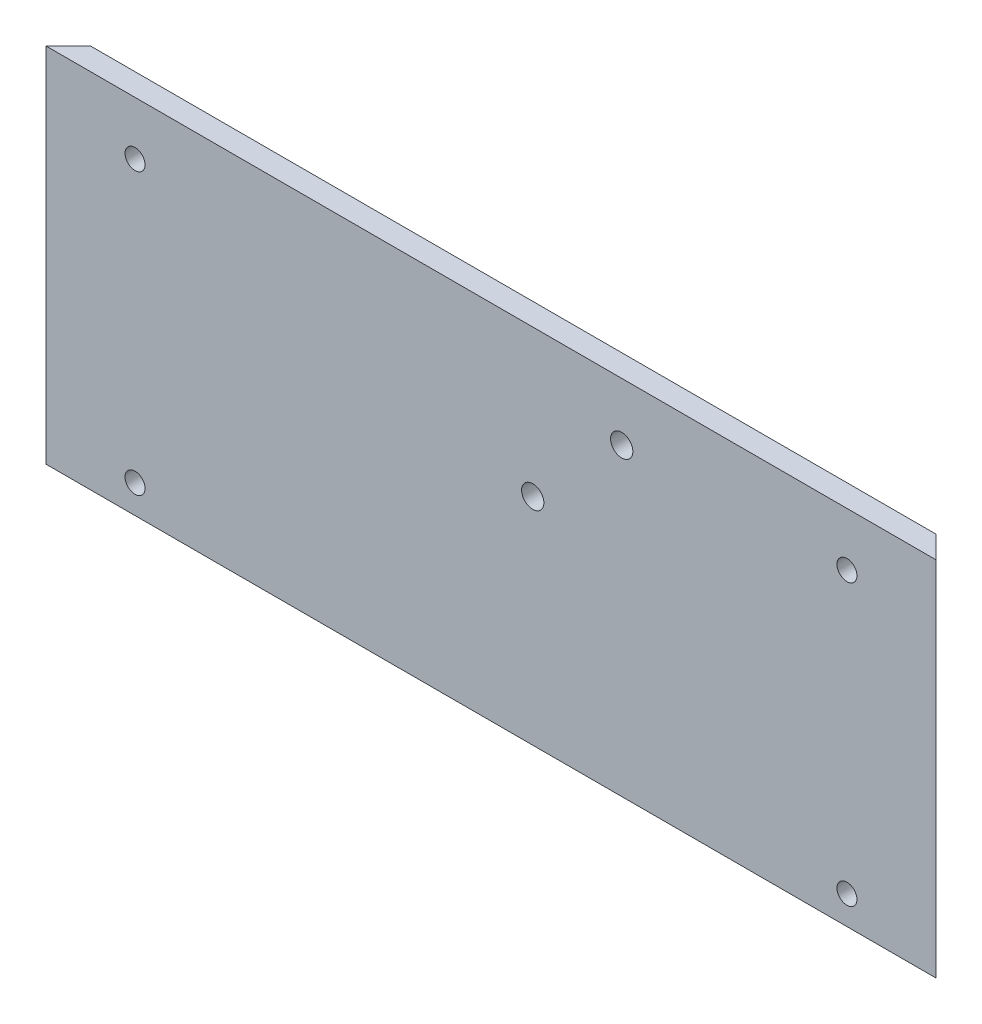
ISO-10303-21;
HEADER;
FILE_DESCRIPTION(('STEP AP214'),'2;1');
FILE_NAME('part.step','',(''),(''),'','','');
FILE_SCHEMA(('AUTOMOTIVE_DESIGN { 1 0 10303 214 1 1 1 1 }'));
ENDSEC;
DATA;
#1=APPLICATION_CONTEXT('core data for automotive mechanical design processes');
#2=APPLICATION_PROTOCOL_DEFINITION('international standard','automotive_design',2000,#1);
#3=PRODUCT_CONTEXT('',#1,'mechanical');
#4=PRODUCT('Part','Part','',(#3));
#5=PRODUCT_RELATED_PRODUCT_CATEGORY('part','',(#4));
#6=PRODUCT_DEFINITION_FORMATION('','',#4);
#7=PRODUCT_DEFINITION_CONTEXT('part definition',#1,'design');
#8=PRODUCT_DEFINITION('design','',#6,#7);
#9=PRODUCT_DEFINITION_SHAPE('','',#8);
#10=(LENGTH_UNIT() NAMED_UNIT(*) SI_UNIT(.MILLI.,.METRE.));
#11=(NAMED_UNIT(*) PLANE_ANGLE_UNIT() SI_UNIT($,.RADIAN.));
#12=(NAMED_UNIT(*) SI_UNIT($,.STERADIAN.) SOLID_ANGLE_UNIT());
#13=UNCERTAINTY_MEASURE_WITH_UNIT(LENGTH_MEASURE(1.E-05),#10,'distance_accuracy_value','');
#14=(GEOMETRIC_REPRESENTATION_CONTEXT(3) GLOBAL_UNCERTAINTY_ASSIGNED_CONTEXT((#13)) GLOBAL_UNIT_ASSIGNED_CONTEXT((#10,
#11,#12)) REPRESENTATION_CONTEXT('',''));
#15=CARTESIAN_POINT('',(0.,0.,0.));
#16=DIRECTION('',(0.,0.,1.));
#17=DIRECTION('',(1.,0.,0.));
#18=AXIS2_PLACEMENT_3D('',#15,#16,#17);
#19=CARTESIAN_POINT('',(0.,84.,-5.));
#20=DIRECTION('',(0.,1.,0.));
#21=DIRECTION('',(0.,0.,1.));
#22=AXIS2_PLACEMENT_3D('',#19,#20,#21);
#23=PLANE('',#22);
#24=DIRECTION('',(-0.707106781186546,0.,-0.707106781186549));
#25=VECTOR('',#24,1.);
#26=CARTESIAN_POINT('',(97.5000000000003,84.,-102.5));
#27=LINE('',#26,#25);
#28=CARTESIAN_POINT('',(200.,84.,0.));
#29=VERTEX_POINT('',#28);
#30=CARTESIAN_POINT('',(195.,84.,-4.99999999999998));
#31=VERTEX_POINT('',#30);
#32=EDGE_CURVE('E130',#29,#31,#27,.T.);
#33=ORIENTED_EDGE('',*,*,#32,.T.);
#34=DIRECTION('',(-1.,0.,0.));
#35=VECTOR('',#34,1.);
#36=CARTESIAN_POINT('',(8.00000000000001,84.,-5.));
#37=LINE('',#36,#35);
#38=CARTESIAN_POINT('',(5.00000000000002,84.,-5.));
#39=VERTEX_POINT('',#38);
#40=EDGE_CURVE('E65',#31,#39,#37,.T.);
#41=ORIENTED_EDGE('',*,*,#40,.T.);
#42=DIRECTION('',(-0.707106781186546,0.,0.707106781186549));
#43=VECTOR('',#42,1.);
#44=CARTESIAN_POINT('',(2.50000000000002,84.,-2.49999999999999));
#45=LINE('',#44,#43);
#46=CARTESIAN_POINT('',(0.,84.,0.));
#47=VERTEX_POINT('',#46);
#48=EDGE_CURVE('E125',#39,#47,#45,.T.);
#49=ORIENTED_EDGE('',*,*,#48,.T.);
#50=DIRECTION('',(-1.,0.,0.));
#51=VECTOR('',#50,1.);
#52=CARTESIAN_POINT('',(0.,84.,0.));
#53=LINE('',#52,#51);
#54=EDGE_CURVE('E166',#29,#47,#53,.T.);
#55=ORIENTED_EDGE('',*,*,#54,.F.);
#56=EDGE_LOOP('',(#33,#41,#49,#55));
#57=FACE_BOUND('',#56,.T.);
#58=ADVANCED_FACE('F41',(#57),#23,.T.);
#59=CARTESIAN_POINT('',(0.,0.,-5.));
#60=DIRECTION('',(0.,0.,-1.));
#61=DIRECTION('',(-1.,0.,0.));
#62=AXIS2_PLACEMENT_3D('',#59,#60,#61);
#63=PLANE('',#62);
#64=DIRECTION('',(1.,0.,0.));
#65=VECTOR('',#64,1.);
#66=CARTESIAN_POINT('',(-5.,2.59999999999993,-4.99999999999971));
#67=LINE('',#66,#65);
#68=CARTESIAN_POINT('',(4.99999999999973,2.59999999999993,-4.99999999999971));
#69=VERTEX_POINT('',#68);
#70=CARTESIAN_POINT('',(195.,2.59999999999993,-4.99999999999971));
#71=VERTEX_POINT('',#70);
#72=EDGE_CURVE('E100',#69,#71,#67,.T.);
#73=ORIENTED_EDGE('',*,*,#72,.F.);
#74=DIRECTION('',(0.,1.,0.));
#75=VECTOR('',#74,1.);
#76=CARTESIAN_POINT('',(5.00000000000002,0.,-5.));
#77=LINE('',#76,#75);
#78=CARTESIAN_POINT('',(5.00000000000002,5.,-5.));
#79=VERTEX_POINT('',#78);
#80=EDGE_CURVE('E126',#69,#79,#77,.T.);
#81=ORIENTED_EDGE('',*,*,#80,.T.);
#82=DIRECTION('',(-1.,0.,0.));
#83=VECTOR('',#82,1.);
#84=CARTESIAN_POINT('',(0.,5.,-5.));
#85=LINE('',#84,#83);
#86=CARTESIAN_POINT('',(195.,4.99999999999996,-5.));
#87=VERTEX_POINT('',#86);
#88=EDGE_CURVE('E123',#87,#79,#85,.T.);
#89=ORIENTED_EDGE('',*,*,#88,.F.);
#90=DIRECTION('',(0.,-1.,0.));
#91=VECTOR('',#90,1.);
#92=CARTESIAN_POINT('',(195.,0.,-5.));
#93=LINE('',#92,#91);
#94=EDGE_CURVE('E114',#87,#71,#93,.T.);
#95=ORIENTED_EDGE('',*,*,#94,.T.);
#96=EDGE_LOOP('',(#73,#81,#89,#95));
#97=FACE_BOUND('',#96,.T.);
#98=ADVANCED_FACE('F121',(#97),#63,.T.);
#99=CARTESIAN_POINT('',(0.,0.,0.));
#100=DIRECTION('',(0.,0.,-1.));
#101=DIRECTION('',(-1.,0.,0.));
#102=AXIS2_PLACEMENT_3D('',#99,#100,#101);
#103=PLANE('',#102);
#104=CARTESIAN_POINT('',(129.377508283547,71.,0.));
#105=DIRECTION('',(0.,0.,1.));
#106=DIRECTION('',(1.,0.,0.));
#107=AXIS2_PLACEMENT_3D('',#104,#105,#106);
#108=CIRCLE('',#107,2.5);
#109=CARTESIAN_POINT('',(131.877508283547,71.,0.));
#110=VERTEX_POINT('',#109);
#111=EDGE_CURVE('E187',#110,#110,#108,.T.);
#112=ORIENTED_EDGE('',*,*,#111,.F.);
#113=EDGE_LOOP('',(#112));
#114=FACE_BOUND('',#113,.T.);
#115=CARTESIAN_POINT('',(109.377508283547,51.,0.));
#116=DIRECTION('',(0.,0.,1.));
#117=DIRECTION('',(1.,0.,0.));
#118=AXIS2_PLACEMENT_3D('',#115,#116,#117);
#119=CIRCLE('',#118,2.5);
#120=CARTESIAN_POINT('',(111.877508283547,51.,0.));
#121=VERTEX_POINT('',#120);
#122=EDGE_CURVE('E192',#121,#121,#119,.T.);
#123=ORIENTED_EDGE('',*,*,#122,.F.);
#124=EDGE_LOOP('',(#123));
#125=FACE_BOUND('',#124,.T.);
#126=CARTESIAN_POINT('',(180.,72.,0.));
#127=DIRECTION('',(0.,0.,1.));
#128=DIRECTION('',(-1.,0.,0.));
#129=AXIS2_PLACEMENT_3D('',#126,#127,#128);
#130=CIRCLE('',#129,2.25000000000001);
#131=CARTESIAN_POINT('',(177.75,72.,0.));
#132=VERTEX_POINT('',#131);
#133=EDGE_CURVE('E202',#132,#132,#130,.T.);
#134=ORIENTED_EDGE('',*,*,#133,.F.);
#135=EDGE_LOOP('',(#134));
#136=FACE_BOUND('',#135,.T.);
#137=CARTESIAN_POINT('',(20.,72.,0.));
#138=DIRECTION('',(0.,0.,1.));
#139=DIRECTION('',(1.,0.,0.));
#140=AXIS2_PLACEMENT_3D('',#137,#138,#139);
#141=CIRCLE('',#140,2.25);
#142=CARTESIAN_POINT('',(22.25,72.,0.));
#143=VERTEX_POINT('',#142);
#144=EDGE_CURVE('E206',#143,#143,#141,.T.);
#145=ORIENTED_EDGE('',*,*,#144,.F.);
#146=EDGE_LOOP('',(#145));
#147=FACE_BOUND('',#146,.T.);
#148=CARTESIAN_POINT('',(180.,9.,0.));
#149=DIRECTION('',(0.,0.,1.));
#150=DIRECTION('',(-1.,0.,0.));
#151=AXIS2_PLACEMENT_3D('',#148,#149,#150);
#152=CIRCLE('',#151,2.25000000000001);
#153=CARTESIAN_POINT('',(177.75,9.,0.));
#154=VERTEX_POINT('',#153);
#155=EDGE_CURVE('E210',#154,#154,#152,.T.);
#156=ORIENTED_EDGE('',*,*,#155,.F.);
#157=EDGE_LOOP('',(#156));
#158=FACE_BOUND('',#157,.T.);
#159=CARTESIAN_POINT('',(20.,9.,0.));
#160=DIRECTION('',(0.,0.,1.));
#161=DIRECTION('',(1.,0.,0.));
#162=AXIS2_PLACEMENT_3D('',#159,#160,#161);
#163=CIRCLE('',#162,2.25);
#164=CARTESIAN_POINT('',(22.25,9.,0.));
#165=VERTEX_POINT('',#164);
#166=EDGE_CURVE('E214',#165,#165,#163,.T.);
#167=ORIENTED_EDGE('',*,*,#166,.F.);
#168=EDGE_LOOP('',(#167));
#169=FACE_BOUND('',#168,.T.);
#170=DIRECTION('',(0.,-1.,0.));
#171=VECTOR('',#170,1.);
#172=CARTESIAN_POINT('',(0.,0.,0.));
#173=LINE('',#172,#171);
#174=CARTESIAN_POINT('',(0.,2.59999999999993,0.));
#175=VERTEX_POINT('',#174);
#176=EDGE_CURVE('E175',#47,#175,#173,.T.);
#177=ORIENTED_EDGE('',*,*,#176,.T.);
#178=DIRECTION('',(1.,0.,0.));
#179=VECTOR('',#178,1.);
#180=CARTESIAN_POINT('',(0.,2.59999999999993,3.33066907387547E-13));
#181=LINE('',#180,#179);
#182=CARTESIAN_POINT('',(200.,2.59999999999993,3.33066907387547E-13));
#183=VERTEX_POINT('',#182);
#184=EDGE_CURVE('E57',#175,#183,#181,.T.);
#185=ORIENTED_EDGE('',*,*,#184,.T.);
#186=DIRECTION('',(0.,1.,0.));
#187=VECTOR('',#186,1.);
#188=CARTESIAN_POINT('',(200.,0.,0.));
#189=LINE('',#188,#187);
#190=EDGE_CURVE('E116',#183,#29,#189,.T.);
#191=ORIENTED_EDGE('',*,*,#190,.T.);
#192=ORIENTED_EDGE('',*,*,#54,.T.);
#193=EDGE_LOOP('',(#177,#185,#191,#192));
#194=FACE_BOUND('',#193,.T.);
#195=ADVANCED_FACE('F218',(#114,#125,#136,#147,#158,#169,#194),#103,.F.);
#196=CARTESIAN_POINT('',(20.,9.,-5.));
#197=DIRECTION('',(0.,0.,1.));
#198=DIRECTION('',(1.,0.,0.));
#199=AXIS2_PLACEMENT_3D('',#196,#197,#198);
#200=CYLINDRICAL_SURFACE('',#199,2.25);
#201=ORIENTED_EDGE('',*,*,#166,.T.);
#202=EDGE_LOOP('',(#201));
#203=FACE_BOUND('',#202,.T.);
#204=CARTESIAN_POINT('',(20.,9.,-8.));
#205=DIRECTION('',(0.,0.,-1.));
#206=DIRECTION('',(-1.,0.,0.));
#207=AXIS2_PLACEMENT_3D('',#204,#205,#206);
#208=CIRCLE('',#207,2.25);
#209=CARTESIAN_POINT('',(17.75,9.,-8.));
#210=VERTEX_POINT('',#209);
#211=EDGE_CURVE('E230',#210,#210,#208,.T.);
#212=ORIENTED_EDGE('',*,*,#211,.T.);
#213=EDGE_LOOP('',(#212));
#214=FACE_BOUND('',#213,.T.);
#215=ADVANCED_FACE('F311',(#203,#214),#200,.F.);
#216=CARTESIAN_POINT('',(180.,9.,-5.));
#217=DIRECTION('',(0.,0.,1.));
#218=DIRECTION('',(1.,0.,0.));
#219=AXIS2_PLACEMENT_3D('',#216,#217,#218);
#220=CYLINDRICAL_SURFACE('',#219,2.25000000000001);
#221=ORIENTED_EDGE('',*,*,#155,.T.);
#222=EDGE_LOOP('',(#221));
#223=FACE_BOUND('',#222,.T.);
#224=CARTESIAN_POINT('',(180.,9.,-8.));
#225=DIRECTION('',(0.,0.,-1.));
#226=DIRECTION('',(-1.,0.,0.));
#227=AXIS2_PLACEMENT_3D('',#224,#225,#226);
#228=CIRCLE('',#227,2.25000000000001);
#229=CARTESIAN_POINT('',(177.75,9.,-8.));
#230=VERTEX_POINT('',#229);
#231=EDGE_CURVE('E224',#230,#230,#228,.T.);
#232=ORIENTED_EDGE('',*,*,#231,.T.);
#233=EDGE_LOOP('',(#232));
#234=FACE_BOUND('',#233,.T.);
#235=ADVANCED_FACE('F261',(#223,#234),#220,.F.);
#236=CARTESIAN_POINT('',(20.,72.,-5.));
#237=DIRECTION('',(0.,0.,1.));
#238=DIRECTION('',(1.,0.,0.));
#239=AXIS2_PLACEMENT_3D('',#236,#237,#238);
#240=CYLINDRICAL_SURFACE('',#239,2.25);
#241=ORIENTED_EDGE('',*,*,#144,.T.);
#242=EDGE_LOOP('',(#241));
#243=FACE_BOUND('',#242,.T.);
#244=CARTESIAN_POINT('',(20.,72.,-8.));
#245=DIRECTION('',(0.,0.,-1.));
#246=DIRECTION('',(-1.,0.,0.));
#247=AXIS2_PLACEMENT_3D('',#244,#245,#246);
#248=CIRCLE('',#247,2.25000000000001);
#249=CARTESIAN_POINT('',(17.75,72.,-8.));
#250=VERTEX_POINT('',#249);
#251=EDGE_CURVE('E194',#250,#250,#248,.T.);
#252=ORIENTED_EDGE('',*,*,#251,.T.);
#253=EDGE_LOOP('',(#252));
#254=FACE_BOUND('',#253,.T.);
#255=ADVANCED_FACE('F239',(#243,#254),#240,.F.);
#256=CARTESIAN_POINT('',(180.,72.,-5.));
#257=DIRECTION('',(0.,0.,1.));
#258=DIRECTION('',(1.,0.,0.));
#259=AXIS2_PLACEMENT_3D('',#256,#257,#258);
#260=CYLINDRICAL_SURFACE('',#259,2.25000000000001);
#261=ORIENTED_EDGE('',*,*,#133,.T.);
#262=EDGE_LOOP('',(#261));
#263=FACE_BOUND('',#262,.T.);
#264=CARTESIAN_POINT('',(180.,72.,-8.));
#265=DIRECTION('',(0.,0.,-1.));
#266=DIRECTION('',(-1.,0.,0.));
#267=AXIS2_PLACEMENT_3D('',#264,#265,#266);
#268=CIRCLE('',#267,2.25000000000001);
#269=CARTESIAN_POINT('',(177.75,72.,-8.));
#270=VERTEX_POINT('',#269);
#271=EDGE_CURVE('E220',#270,#270,#268,.T.);
#272=ORIENTED_EDGE('',*,*,#271,.T.);
#273=EDGE_LOOP('',(#272));
#274=FACE_BOUND('',#273,.T.);
#275=ADVANCED_FACE('F249',(#263,#274),#260,.F.);
#276=CARTESIAN_POINT('',(109.377508283547,51.,-5.));
#277=DIRECTION('',(0.,0.,1.));
#278=DIRECTION('',(1.,0.,0.));
#279=AXIS2_PLACEMENT_3D('',#276,#277,#278);
#280=CYLINDRICAL_SURFACE('',#279,2.5);
#281=ORIENTED_EDGE('',*,*,#122,.T.);
#282=EDGE_LOOP('',(#281));
#283=FACE_BOUND('',#282,.T.);
#284=CARTESIAN_POINT('',(109.377508283547,51.,-8.));
#285=DIRECTION('',(0.,0.,1.));
#286=DIRECTION('',(1.,0.,0.));
#287=AXIS2_PLACEMENT_3D('',#284,#285,#286);
#288=CIRCLE('',#287,2.5);
#289=CARTESIAN_POINT('',(111.877508283547,51.,-8.));
#290=VERTEX_POINT('',#289);
#291=EDGE_CURVE('E301',#290,#290,#288,.T.);
#292=ORIENTED_EDGE('',*,*,#291,.F.);
#293=EDGE_LOOP('',(#292));
#294=FACE_BOUND('',#293,.T.);
#295=ADVANCED_FACE('F251',(#283,#294),#280,.F.);
#296=CARTESIAN_POINT('',(129.377508283547,71.,-5.));
#297=DIRECTION('',(0.,0.,1.));
#298=DIRECTION('',(1.,0.,0.));
#299=AXIS2_PLACEMENT_3D('',#296,#297,#298);
#300=CYLINDRICAL_SURFACE('',#299,2.5);
#301=ORIENTED_EDGE('',*,*,#111,.T.);
#302=EDGE_LOOP('',(#301));
#303=FACE_BOUND('',#302,.T.);
#304=CARTESIAN_POINT('',(129.377508283547,71.,-8.));
#305=DIRECTION('',(0.,0.,1.));
#306=DIRECTION('',(1.,0.,0.));
#307=AXIS2_PLACEMENT_3D('',#304,#305,#306);
#308=CIRCLE('',#307,2.5);
#309=CARTESIAN_POINT('',(131.877508283547,71.,-8.));
#310=VERTEX_POINT('',#309);
#311=EDGE_CURVE('E118',#310,#310,#308,.T.);
#312=ORIENTED_EDGE('',*,*,#311,.F.);
#313=EDGE_LOOP('',(#312));
#314=FACE_BOUND('',#313,.T.);
#315=ADVANCED_FACE('F258',(#303,#314),#300,.F.);
#316=CARTESIAN_POINT('',(0.,5.,-8.));
#317=DIRECTION('',(0.,1.,0.));
#318=DIRECTION('',(-1.,0.,0.));
#319=AXIS2_PLACEMENT_3D('',#316,#317,#318);
#320=PLANE('',#319);
#321=DIRECTION('',(-1.,0.,0.));
#322=VECTOR('',#321,1.);
#323=CARTESIAN_POINT('',(0.,5.,-8.));
#324=LINE('',#323,#322);
#325=CARTESIAN_POINT('',(192.,4.99999999999997,-8.));
#326=VERTEX_POINT('',#325);
#327=CARTESIAN_POINT('',(8.00000000000001,5.,-8.));
#328=VERTEX_POINT('',#327);
#329=EDGE_CURVE('E163',#326,#328,#324,.T.);
#330=ORIENTED_EDGE('',*,*,#329,.F.);
#331=DIRECTION('',(0.707106781186546,0.,0.707106781186549));
#332=VECTOR('',#331,1.);
#333=CARTESIAN_POINT('',(192.,4.99999999999997,-8.));
#334=LINE('',#333,#332);
#335=EDGE_CURVE('E132',#326,#87,#334,.T.);
#336=ORIENTED_EDGE('',*,*,#335,.T.);
#337=ORIENTED_EDGE('',*,*,#88,.T.);
#338=DIRECTION('',(0.707106781186546,0.,-0.707106781186549));
#339=VECTOR('',#338,1.);
#340=CARTESIAN_POINT('',(8.00000000000001,5.,-8.));
#341=LINE('',#340,#339);
#342=EDGE_CURVE('E181',#79,#328,#341,.T.);
#343=ORIENTED_EDGE('',*,*,#342,.T.);
#344=EDGE_LOOP('',(#330,#336,#337,#343));
#345=FACE_BOUND('',#344,.T.);
#346=ADVANCED_FACE('F185',(#345),#320,.F.);
#347=CARTESIAN_POINT('',(0.,0.,-8.));
#348=DIRECTION('',(0.,0.,1.));
#349=DIRECTION('',(1.,0.,0.));
#350=AXIS2_PLACEMENT_3D('',#347,#348,#349);
#351=PLANE('',#350);
#352=ORIENTED_EDGE('',*,*,#311,.T.);
#353=EDGE_LOOP('',(#352));
#354=FACE_BOUND('',#353,.T.);
#355=ORIENTED_EDGE('',*,*,#291,.T.);
#356=EDGE_LOOP('',(#355));
#357=FACE_BOUND('',#356,.T.);
#358=DIRECTION('',(0.,1.,0.));
#359=VECTOR('',#358,1.);
#360=CARTESIAN_POINT('',(8.00000000000001,84.,-8.));
#361=LINE('',#360,#359);
#362=CARTESIAN_POINT('',(8.00000000000001,81.,-8.));
#363=VERTEX_POINT('',#362);
#364=EDGE_CURVE('E153',#328,#363,#361,.T.);
#365=ORIENTED_EDGE('',*,*,#364,.T.);
#366=DIRECTION('',(1.,0.,0.));
#367=VECTOR('',#366,1.);
#368=CARTESIAN_POINT('',(192.,81.,-8.));
#369=LINE('',#368,#367);
#370=CARTESIAN_POINT('',(192.,81.,-8.));
#371=VERTEX_POINT('',#370);
#372=EDGE_CURVE('E138',#363,#371,#369,.T.);
#373=ORIENTED_EDGE('',*,*,#372,.T.);
#374=DIRECTION('',(0.,-1.,0.));
#375=VECTOR('',#374,1.);
#376=CARTESIAN_POINT('',(192.,4.99999999999996,-8.));
#377=LINE('',#376,#375);
#378=EDGE_CURVE('E165',#371,#326,#377,.T.);
#379=ORIENTED_EDGE('',*,*,#378,.T.);
#380=ORIENTED_EDGE('',*,*,#329,.T.);
#381=EDGE_LOOP('',(#365,#373,#379,#380));
#382=FACE_BOUND('',#381,.T.);
#383=ORIENTED_EDGE('',*,*,#251,.F.);
#384=EDGE_LOOP('',(#383));
#385=FACE_BOUND('',#384,.T.);
#386=ORIENTED_EDGE('',*,*,#211,.F.);
#387=EDGE_LOOP('',(#386));
#388=FACE_BOUND('',#387,.T.);
#389=ORIENTED_EDGE('',*,*,#231,.F.);
#390=EDGE_LOOP('',(#389));
#391=FACE_BOUND('',#390,.T.);
#392=ORIENTED_EDGE('',*,*,#271,.F.);
#393=EDGE_LOOP('',(#392));
#394=FACE_BOUND('',#393,.T.);
#395=ADVANCED_FACE('F159',(#354,#357,#382,#385,#388,#391,#394),#351,.F.);
#396=CARTESIAN_POINT('',(192.,0.,-8.));
#397=DIRECTION('',(0.707106781186549,0.,-0.707106781186546));
#398=DIRECTION('',(0.,1.,0.));
#399=AXIS2_PLACEMENT_3D('',#396,#397,#398);
#400=PLANE('',#399);
#401=DIRECTION('',(0.707106781186544,0.,0.70710678118655));
#402=VECTOR('',#401,1.);
#403=CARTESIAN_POINT('',(200.,2.59999999999993,3.33066907387547E-13));
#404=LINE('',#403,#402);
#405=EDGE_CURVE('E103',#71,#183,#404,.T.);
#406=ORIENTED_EDGE('',*,*,#405,.F.);
#407=ORIENTED_EDGE('',*,*,#94,.F.);
#408=ORIENTED_EDGE('',*,*,#335,.F.);
#409=ORIENTED_EDGE('',*,*,#378,.F.);
#410=DIRECTION('',(0.577350269189624,0.577350269189627,0.577350269189626));
#411=VECTOR('',#410,1.);
#412=CARTESIAN_POINT('',(165.,53.9999999999999,-35.0000000000001));
#413=LINE('',#412,#411);
#414=EDGE_CURVE('E142',#371,#31,#413,.T.);
#415=ORIENTED_EDGE('',*,*,#414,.T.);
#416=ORIENTED_EDGE('',*,*,#32,.F.);
#417=ORIENTED_EDGE('',*,*,#190,.F.);
#418=EDGE_LOOP('',(#406,#407,#408,#409,#415,#416,#417));
#419=FACE_BOUND('',#418,.T.);
#420=ADVANCED_FACE('F112',(#419),#400,.T.);
#421=CARTESIAN_POINT('',(8.00000000000001,0.,-8.));
#422=DIRECTION('',(-0.707106781186549,0.,-0.707106781186546));
#423=DIRECTION('',(0.,-1.,0.));
#424=AXIS2_PLACEMENT_3D('',#421,#422,#423);
#425=PLANE('',#424);
#426=DIRECTION('',(0.707106781186546,0.,-0.707106781186549));
#427=VECTOR('',#426,1.);
#428=CARTESIAN_POINT('',(8.00000000000001,2.59999999999993,-8.));
#429=LINE('',#428,#427);
#430=EDGE_CURVE('E11',#175,#69,#429,.T.);
#431=ORIENTED_EDGE('',*,*,#430,.F.);
#432=ORIENTED_EDGE('',*,*,#176,.F.);
#433=ORIENTED_EDGE('',*,*,#48,.F.);
#434=DIRECTION('',(0.577350269189624,-0.577350269189627,-0.577350269189626));
#435=VECTOR('',#434,1.);
#436=CARTESIAN_POINT('',(35.,53.9999999999999,-35.0000000000001));
#437=LINE('',#436,#435);
#438=EDGE_CURVE('E51',#39,#363,#437,.T.);
#439=ORIENTED_EDGE('',*,*,#438,.T.);
#440=ORIENTED_EDGE('',*,*,#364,.F.);
#441=ORIENTED_EDGE('',*,*,#342,.F.);
#442=ORIENTED_EDGE('',*,*,#80,.F.);
#443=EDGE_LOOP('',(#431,#432,#433,#439,#440,#441,#442));
#444=FACE_BOUND('',#443,.T.);
#445=ADVANCED_FACE('F151',(#444),#425,.T.);
#446=CARTESIAN_POINT('',(0.,81.,-8.));
#447=DIRECTION('',(0.,0.707106781186547,-0.707106781186548));
#448=DIRECTION('',(-1.,0.,0.));
#449=AXIS2_PLACEMENT_3D('',#446,#447,#448);
#450=PLANE('',#449);
#451=ORIENTED_EDGE('',*,*,#438,.F.);
#452=ORIENTED_EDGE('',*,*,#40,.F.);
#453=ORIENTED_EDGE('',*,*,#414,.F.);
#454=ORIENTED_EDGE('',*,*,#372,.F.);
#455=EDGE_LOOP('',(#451,#452,#453,#454));
#456=FACE_BOUND('',#455,.T.);
#457=ADVANCED_FACE('F44',(#456),#450,.T.);
#458=CARTESIAN_POINT('',(0.,2.59999999999993,3.33066907387547E-13));
#459=DIRECTION('',(0.,1.,0.));
#460=DIRECTION('',(-1.,0.,0.));
#461=AXIS2_PLACEMENT_3D('',#458,#459,#460);
#462=PLANE('',#461);
#463=ORIENTED_EDGE('',*,*,#430,.T.);
#464=ORIENTED_EDGE('',*,*,#72,.T.);
#465=ORIENTED_EDGE('',*,*,#405,.T.);
#466=ORIENTED_EDGE('',*,*,#184,.F.);
#467=EDGE_LOOP('',(#463,#464,#465,#466));
#468=FACE_BOUND('',#467,.T.);
#469=ADVANCED_FACE('F102',(#468),#462,.F.);
#470=CLOSED_SHELL('',(#58,#98,#195,#215,#235,#255,#275,#295,#315,#346,#395,#420,#445,#457,#469));
#471=MANIFOLD_SOLID_BREP('B2',#470);
#472=ADVANCED_BREP_SHAPE_REPRESENTATION('',(#18,#471),#14);
#473=SHAPE_DEFINITION_REPRESENTATION(#9,#472);
ENDSEC;
END-ISO-10303-21;
